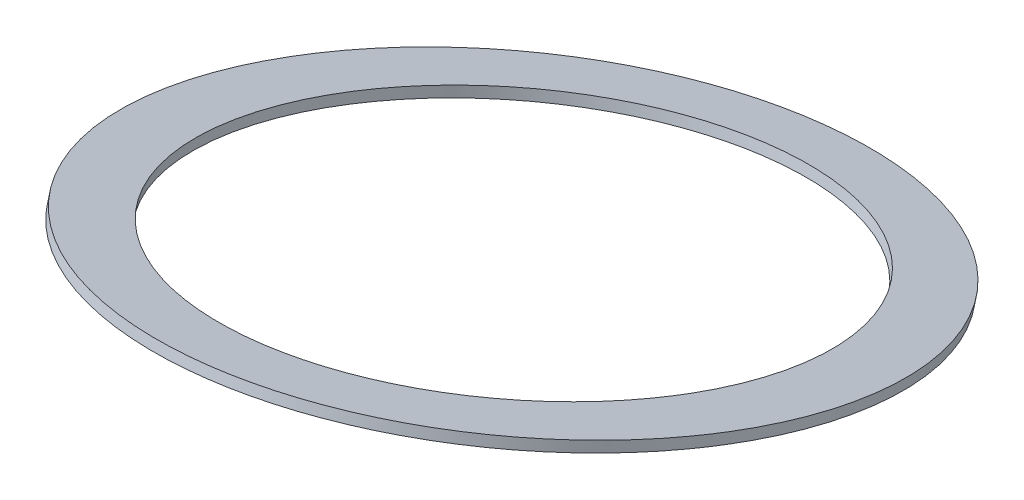
ISO-10303-21;
HEADER;
FILE_DESCRIPTION(('STEP AP214'),'2;1');
FILE_NAME('part.step','',(''),(''),'','','');
FILE_SCHEMA(('AUTOMOTIVE_DESIGN { 1 0 10303 214 1 1 1 1 }'));
ENDSEC;
DATA;
#1=APPLICATION_CONTEXT('core data for automotive mechanical design processes');
#2=APPLICATION_PROTOCOL_DEFINITION('international standard','automotive_design',2000,#1);
#3=PRODUCT_CONTEXT('',#1,'mechanical');
#4=PRODUCT('Part','Part','',(#3));
#5=PRODUCT_RELATED_PRODUCT_CATEGORY('part','',(#4));
#6=PRODUCT_DEFINITION_FORMATION('','',#4);
#7=PRODUCT_DEFINITION_CONTEXT('part definition',#1,'design');
#8=PRODUCT_DEFINITION('design','',#6,#7);
#9=PRODUCT_DEFINITION_SHAPE('','',#8);
#10=(LENGTH_UNIT() NAMED_UNIT(*) SI_UNIT(.MILLI.,.METRE.));
#11=(NAMED_UNIT(*) PLANE_ANGLE_UNIT() SI_UNIT($,.RADIAN.));
#12=(NAMED_UNIT(*) SI_UNIT($,.STERADIAN.) SOLID_ANGLE_UNIT());
#13=UNCERTAINTY_MEASURE_WITH_UNIT(LENGTH_MEASURE(1.E-05),#10,'distance_accuracy_value','');
#14=(GEOMETRIC_REPRESENTATION_CONTEXT(3) GLOBAL_UNCERTAINTY_ASSIGNED_CONTEXT((#13)) GLOBAL_UNIT_ASSIGNED_CONTEXT((#10,
#11,#12)) REPRESENTATION_CONTEXT('',''));
#15=CARTESIAN_POINT('',(0.,0.,0.));
#16=DIRECTION('',(0.,0.,1.));
#17=DIRECTION('',(1.,0.,0.));
#18=AXIS2_PLACEMENT_3D('',#15,#16,#17);
#19=CARTESIAN_POINT('',(-85.1750886992861,247.771421411918,306.996455193439));
#20=DIRECTION('',(-1.42371003184444E-12,0.965925826288984,-0.258819045102834));
#21=DIRECTION('',(0.,0.258819045102834,0.965925826288984));
#22=AXIS2_PLACEMENT_3D('',#19,#20,#21);
#23=PLANE('',#22);
#24=CARTESIAN_POINT('',(306.172324204594,287.085811790094,453.719757550954));
#25=CARTESIAN_POINT('',(304.347898869861,288.956927303349,460.702855713253));
#26=CARTESIAN_POINT('',(300.181465313322,292.645550283985,474.468984086958));
#27=CARTESIAN_POINT('',(292.344724914454,298.027835466678,494.555945849613));
#28=CARTESIAN_POINT('',(282.869375430062,303.247590412852,514.03633651182));
#29=CARTESIAN_POINT('',(271.571170782028,308.316665218783,532.954381234959));
#30=CARTESIAN_POINT('',(258.681952759475,313.06679025664,550.682089218597));
#31=CARTESIAN_POINT('',(246.534327868975,316.756561577623,564.452503256866));
#32=CARTESIAN_POINT('',(235.911531852767,319.529477051817,574.801164691699));
#33=CARTESIAN_POINT('',(227.43267465512,321.521462309189,582.23535488018));
#34=CARTESIAN_POINT('',(218.544747077013,323.390815552696,589.21187616228));
#35=CARTESIAN_POINT('',(206.227945190573,325.696036603486,597.815078246566));
#36=CARTESIAN_POINT('',(193.160898285605,327.72098561537,605.372290841716));
#37=CARTESIAN_POINT('',(179.302732626675,329.439333581655,611.785252757044));
#38=CARTESIAN_POINT('',(164.860262144062,330.941386466919,617.390990440582));
#39=CARTESIAN_POINT('',(146.416027587362,332.328428957376,622.567503487321));
#40=CARTESIAN_POINT('',(127.414909645774,333.06239457043,625.306700446353));
#41=CARTESIAN_POINT('',(111.846517312567,333.236492765333,625.956443755325));
#42=CARTESIAN_POINT('',(96.2125718884808,333.123225988225,625.533726388438));
#43=CARTESIAN_POINT('',(80.9326361163903,332.592123816764,623.551626100627));
#44=CARTESIAN_POINT('',(65.9353039258245,331.661765596812,620.079481954617));
#45=CARTESIAN_POINT('',(54.8124778014216,330.761913390014,616.721187799611));
#46=CARTESIAN_POINT('',(43.9559654122342,329.673499386688,612.659171439596));
#47=CARTESIAN_POINT('',(30.0274839986701,328.002141646771,606.421579436691));
#48=CARTESIAN_POINT('',(13.5123246732928,325.514237086506,597.136593213505));
#49=CARTESIAN_POINT('',(-4.94441674262312,321.919759132723,583.721818863426));
#50=CARTESIAN_POINT('',(-21.4596846960897,317.898170423827,568.713045474796));
#51=CARTESIAN_POINT('',(-33.8343565279769,314.209950617947,554.94842176986));
#52=CARTESIAN_POINT('',(-42.9246444814503,311.071119908982,543.23414608771));
#53=CARTESIAN_POINT('',(-51.3653502480686,307.856486533659,531.236971003364));
#54=CARTESIAN_POINT('',(-60.8017938652706,303.689728104091,515.686416841426));
#55=CARTESIAN_POINT('',(-70.4565188895138,298.471996185195,496.213576219914));
#56=CARTESIAN_POINT('',(-78.512376720301,293.036524897963,475.928121212957));
#57=CARTESIAN_POINT('',(-84.8500700920656,287.528706367179,455.372662617264));
#58=CARTESIAN_POINT('',(-89.5994965951459,281.930690016293,434.480581174212));
#59=CARTESIAN_POINT('',(-92.7963345649909,276.246792883488,413.267988289637));
#60=CARTESIAN_POINT('',(-94.4358148106084,270.477608486196,391.737099000747));
#61=CARTESIAN_POINT('',(-94.5050451682542,264.760975061684,370.40233261225));
#62=CARTESIAN_POINT('',(-93.0473258657436,259.06876945579,349.158732083945));
#63=CARTESIAN_POINT('',(-90.5462152798631,254.348337622781,331.541840649501));
#64=CARTESIAN_POINT('',(-87.7522469480194,250.586979834403,317.504262277834));
#65=CARTESIAN_POINT('',(-85.2411190779154,247.766124344934,306.976686270327));
#66=CARTESIAN_POINT('',(-82.3338089360355,244.977051257366,296.567723801495));
#67=CARTESIAN_POINT('',(-77.9470202599356,241.31934658634,282.916984130138));
#68=CARTESIAN_POINT('',(-71.4944561764333,236.852479607525,266.246409614535));
#69=CARTESIAN_POINT('',(-62.1541687799811,231.666348131173,246.891503450031));
#70=CARTESIAN_POINT('',(-52.9566951313783,227.495100936127,231.324196987157));
#71=CARTESIAN_POINT('',(-44.6764288992194,224.257334131627,219.240686769673));
#72=CARTESIAN_POINT('',(-35.7264851087814,221.085010381284,207.401413355299));
#73=CARTESIAN_POINT('',(-23.5646612231756,217.362393185258,193.508416842553));
#74=CARTESIAN_POINT('',(-9.99852300947815,213.965939923917,180.832680705635));
#75=CARTESIAN_POINT('',(1.75158108457008,211.467006989595,171.506536029981));
#76=CARTESIAN_POINT('',(11.0809948387451,209.701426807969,164.917301087271));
#77=CARTESIAN_POINT('',(20.7639895852223,208.085341519981,158.88598868309));
#78=CARTESIAN_POINT('',(34.1086959229064,206.142304335743,151.63447519045));
#79=CARTESIAN_POINT('',(51.5992269322183,204.116634694154,144.074573168602));
#80=CARTESIAN_POINT('',(74.1564097435158,202.384846270261,137.611450782555));
#81=CARTESIAN_POINT('',(97.0357398750421,201.488230458563,134.265235018302));
#82=CARTESIAN_POINT('',(116.39726679754,201.425518300238,134.03119005707));
#83=CARTESIAN_POINT('',(132.046568714272,201.807641308455,135.457292538383));
#84=CARTESIAN_POINT('',(147.355123707105,202.465442949421,137.912241683682));
#85=CARTESIAN_POINT('',(162.242301577195,203.519836041783,141.847290275434));
#86=CARTESIAN_POINT('',(176.705758397232,204.955554122464,147.205463097793));
#87=CARTESIAN_POINT('',(190.83916606226,206.639631548592,153.490525615893));
#88=CARTESIAN_POINT('',(204.082189267613,208.630469891249,160.920435460259));
#89=CARTESIAN_POINT('',(216.571724679042,210.906684659648,169.41538462478));
#90=CARTESIAN_POINT('',(225.568153233057,212.753105522893,176.306321098506));
#91=CARTESIAN_POINT('',(234.17461363653,214.729098462025,183.680827142682));
#92=CARTESIAN_POINT('',(244.974628850679,217.488419778236,193.978754489114));
#93=CARTESIAN_POINT('',(254.875841470718,220.436701957721,204.981893377932));
#94=CARTESIAN_POINT('',(263.928194447551,223.555144363467,216.620078876587));
#95=CARTESIAN_POINT('',(270.321538809334,225.98442955917,225.686294652975));
#96=CARTESIAN_POINT('',(276.260378064212,228.474746541045,234.980284156237));
#97=CARTESIAN_POINT('',(283.56463050641,231.858331510559,247.607995174132));
#98=CARTESIAN_POINT('',(291.61141022839,236.209135401716,263.845416349631));
#99=CARTESIAN_POINT('',(298.290285089664,240.708345577928,280.636697321122));
#100=CARTESIAN_POINT('',(302.848776874837,244.404082288869,294.429374497708));
#101=CARTESIAN_POINT('',(306.839912787366,248.121566053135,308.303212782217));
#102=CARTESIAN_POINT('',(310.799329030754,252.803038517396,325.774705873029));
#103=CARTESIAN_POINT('',(313.974180659465,258.478359932117,346.955293742007));
#104=CARTESIAN_POINT('',(315.603138506042,264.210349809646,368.347371193374));
#105=CARTESIAN_POINT('',(315.666557308779,270.00857893849,389.986656896115));
#106=CARTESIAN_POINT('',(314.163956535724,275.745007724613,411.395300579909));
#107=CARTESIAN_POINT('',(311.614163444884,280.492715642377,429.113987748491));
#108=CARTESIAN_POINT('',(308.779566484925,284.265736508743,443.195093319782));
#109=CARTESIAN_POINT('',(307.08453687196,286.150254033466,450.228208469804));
#110=CARTESIAN_POINT('',(306.172324204594,287.085811790094,453.719757550954));
#111=B_SPLINE_CURVE_WITH_KNOTS('',3,(#24,#25,#26,#27,#28,#29,#30,#31,#32,#33,#34,#35,#36,#37,
#38,#39,#40,#41,#42,#43,#44,#45,#46,#47,#48,#49,#50,#51,#52,#53,#54,#55,#56,#57,#58,#59,#60,#61,
#62,#63,#64,#65,#66,#67,#68,#69,#70,#71,#72,#73,#74,#75,#76,#77,#78,#79,#80,#81,#82,#83,#84,#85,
#86,#87,#88,#89,#90,#91,#92,#93,#94,#95,#96,#97,#98,#99,#100,#101,#102,#103,#104,#105,#106,#107,
#108,#109,#110),.UNSPECIFIED.,.T.,.F.,(4,1,1,1,1,1,1,1,1,1,1,1,1,1,1,1,1,1,1,1,1,1,1,1,1,1,1,1,
1,1,1,1,1,1,1,1,1,1,1,1,1,1,1,1,1,1,1,1,1,1,1,1,1,1,1,1,1,1,1,1,1,1,1,1,1,1,1,1,1,1,1,1,1,1,1,1,
1,1,1,1,1,1,1,1,4),(0.,0.015625,0.03125,0.046875,0.0625,0.078125,0.09375,0.1015625,0.109375,
0.1171875,0.125,0.140625,0.1484375,0.15625,0.171875,0.1875,0.1953125,0.203125,0.21875,0.2265625,
0.234375,0.2421875,0.25,0.265625,0.28125,0.296875,0.3125,0.3203125,0.328125,0.34375,0.359375,
0.375,0.390625,0.40625,0.421875,0.4375,0.453125,0.46875,0.484375,0.4921875,0.5,0.5078125,
0.515625,0.53125,0.546875,0.5625,0.5703125,0.578125,0.59375,0.609375,0.6171875,0.625,0.6328125,
0.640625,0.65625,0.671875,0.6875,0.703125,0.7109375,0.71875,0.734375,0.7421875,0.75,0.765625,
0.7734375,0.78125,0.7890625,0.796875,0.8125,0.8203125,0.828125,0.8359375,0.84375,0.859375,0.875,
0.8828125,0.890625,0.90625,0.921875,0.9375,0.953125,0.96875,0.984375,0.9921875,1.),.UNSPECIFIED.);
#112=CARTESIAN_POINT('',(306.172324204594,287.085811790094,453.719757550954));
#113=VERTEX_POINT('',#112);
#114=EDGE_CURVE('E10',#113,#113,#111,.T.);
#115=ORIENTED_EDGE('',*,*,#114,.T.);
#116=EDGE_LOOP('',(#115));
#117=FACE_BOUND('',#116,.T.);
#118=CARTESIAN_POINT('',(266.817639882261,283.58054674117,440.637930294618));
#119=CARTESIAN_POINT('',(265.322265847198,285.153344621097,446.507691892541));
#120=CARTESIAN_POINT('',(261.904126751131,288.25041024907,458.066098170516));
#121=CARTESIAN_POINT('',(255.476658523598,292.757728316109,474.887638202592));
#122=CARTESIAN_POINT('',(247.722819432191,297.11350933568,491.143634274298));
#123=CARTESIAN_POINT('',(238.512958949992,301.325136540163,506.861640984001));
#124=CARTESIAN_POINT('',(228.05572208073,305.25308528316,521.520945262431));
#125=CARTESIAN_POINT('',(218.261656909145,308.286455166333,532.841635784622));
#126=CARTESIAN_POINT('',(209.744164153033,310.555909908315,541.311356187216));
#127=CARTESIAN_POINT('',(202.975387930675,312.1801910854,547.373256065902));
#128=CARTESIAN_POINT('',(195.896970610072,313.70225520337,553.053676686578));
#129=CARTESIAN_POINT('',(186.133902048909,315.572098121119,560.032025457837));
#130=CARTESIAN_POINT('',(175.835181831928,317.208035511696,566.137426917521));
#131=CARTESIAN_POINT('',(164.981263272491,318.59266353582,571.304929053191));
#132=CARTESIAN_POINT('',(153.706102688141,319.802910034196,575.821630474869));
#133=CARTESIAN_POINT('',(139.364744505483,320.923026756233,580.001962991997));
#134=CARTESIAN_POINT('',(121.732847794373,321.651086680862,582.719119621764));
#135=CARTESIAN_POINT('',(103.492125815609,321.727454362987,583.004127691613));
#136=CARTESIAN_POINT('',(88.6690658677689,321.238480782929,581.179253447367));
#137=CARTESIAN_POINT('',(76.9902885785219,320.532818455893,578.54568578995));
#138=CARTESIAN_POINT('',(68.2974370083837,319.84209638036,575.967875910204));
#139=CARTESIAN_POINT('',(59.7796304433671,318.999570191684,572.823525367414));
#140=CARTESIAN_POINT('',(48.8012965312066,317.695385213135,567.956240765067));
#141=CARTESIAN_POINT('',(35.6916324508077,315.73552010179,560.641924593633));
#142=CARTESIAN_POINT('',(20.8990690958388,312.869670156692,549.946426991758));
#143=CARTESIAN_POINT('',(7.53778577796836,309.629690880527,537.854659717733));
#144=CARTESIAN_POINT('',(-2.57146504460217,306.627526739899,526.650430612321));
#145=CARTESIAN_POINT('',(-10.0337079103882,304.059262532712,517.065538103894));
#146=CARTESIAN_POINT('',(-16.9879301210659,301.420007590385,507.215704565054));
#147=CARTESIAN_POINT('',(-24.8108032739061,297.980232945157,494.378290822538));
#148=CARTESIAN_POINT('',(-32.872721110139,293.64488337339,478.1985459522));
#149=CARTESIAN_POINT('',(-39.6339418636796,289.111997953412,461.281587260015));
#150=CARTESIAN_POINT('',(-44.986861743239,284.50224742447,444.07776407584));
#151=CARTESIAN_POINT('',(-49.0303392979788,279.800121920594,426.529192791858));
#152=CARTESIAN_POINT('',(-51.3217082275455,275.814453825694,411.654476959618));
#153=CARTESIAN_POINT('',(-52.5084786061881,272.580303144593,399.584462298438));
#154=CARTESIAN_POINT('',(-53.2504740716067,269.355195093457,387.548195191718));
#155=CARTESIAN_POINT('',(-53.3643486621752,265.336656400986,372.550804619258));
#156=CARTESIAN_POINT('',(-52.2193171237224,260.537932012041,354.641721388213));
#157=CARTESIAN_POINT('',(-50.1901685914083,256.558568288067,339.790533788552));
#158=CARTESIAN_POINT('',(-47.9062101712495,253.390495151622,327.967123881249));
#159=CARTESIAN_POINT('',(-45.1612198279835,250.224436329799,316.151231498455));
#160=CARTESIAN_POINT('',(-40.92711391214,246.354849047363,301.709735156077));
#161=CARTESIAN_POINT('',(-34.5800334311619,241.867549651482,284.962905821864));
#162=CARTESIAN_POINT('',(-26.9356057342923,237.538015562865,268.80486463002));
#163=CARTESIAN_POINT('',(-19.4337551994741,234.0699412555,255.861835110485));
#164=CARTESIAN_POINT('',(-12.7025154242321,231.386673770442,245.847744525927));
#165=CARTESIAN_POINT('',(-5.45241919379536,228.766870348767,236.070505050363));
#166=CARTESIAN_POINT('',(4.35293152092321,225.706376118181,224.648585085507));
#167=CARTESIAN_POINT('',(15.2186464205768,222.929687982812,214.285843887488));
#168=CARTESIAN_POINT('',(24.5759463224158,220.895597327894,206.694514216087));
#169=CARTESIAN_POINT('',(34.4432242750308,218.984893179505,199.563669256021));
#170=CARTESIAN_POINT('',(47.3815606423098,216.912784532585,191.83045450685));
#171=CARTESIAN_POINT('',(63.8050117973126,214.95511937935,184.524348690687));
#172=CARTESIAN_POINT('',(81.339695892977,213.557254263189,179.307445054951));
#173=CARTESIAN_POINT('',(99.0427940258649,212.818322105869,176.549712700391));
#174=CARTESIAN_POINT('',(114.025775767205,212.736973000022,176.246113704135));
#175=CARTESIAN_POINT('',(126.154437265263,213.01000289796,177.265075155152));
#176=CARTESIAN_POINT('',(138.03668165161,213.5002880002,179.094844066834));
#177=CARTESIAN_POINT('',(152.538183966717,214.503002346179,182.837024951419));
#178=CARTESIAN_POINT('',(169.496979621341,216.335960670869,189.677718547212));
#179=CARTESIAN_POINT('',(182.642271213442,218.297859709068,196.999625437009));
#180=CARTESIAN_POINT('',(192.627314082613,220.108020273276,203.755236632424));
#181=CARTESIAN_POINT('',(199.863805816248,221.586918199425,209.27455883197));
#182=CARTESIAN_POINT('',(206.800520024024,223.173626846936,215.196236121243));
#183=CARTESIAN_POINT('',(215.551088339599,225.401525711,223.510867875992));
#184=CARTESIAN_POINT('',(223.6343817789,227.799876709772,232.461635657737));
#185=CARTESIAN_POINT('',(231.073576962612,230.354433886075,241.995372830481));
#186=CARTESIAN_POINT('',(238.105566233107,233.018095105422,251.936291835184));
#187=CARTESIAN_POINT('',(245.970768483759,236.476184038,264.842055428592));
#188=CARTESIAN_POINT('',(254.026984850007,240.810554751146,281.018147148824));
#189=CARTESIAN_POINT('',(259.64094689957,244.568870860865,295.044373821148));
#190=CARTESIAN_POINT('',(263.484485833846,247.661537200707,306.586361732258));
#191=CARTESIAN_POINT('',(266.855126474046,250.772037243333,318.19490592825));
#192=CARTESIAN_POINT('',(270.223628813987,254.702481903168,332.863525095052));
#193=CARTESIAN_POINT('',(272.955058122431,259.478711613904,350.688657044099));
#194=CARTESIAN_POINT('',(274.395170038203,264.31594342587,368.741451934311));
#195=CARTESIAN_POINT('',(274.521399961762,269.202593866538,386.978679657688));
#196=CARTESIAN_POINT('',(273.33903546527,274.034695683116,405.012329144485));
#197=CARTESIAN_POINT('',(271.269987419745,278.033816536855,419.937251356239));
#198=CARTESIAN_POINT('',(268.95385317837,281.20921738831,431.788008668265));
#199=CARTESIAN_POINT('',(267.565326899792,282.794147801207,437.703049495656));
#200=CARTESIAN_POINT('',(266.817639882261,283.58054674117,440.637930294618));
#201=B_SPLINE_CURVE_WITH_KNOTS('',3,(#118,#119,#120,#121,#122,#123,#124,#125,#126,#127,#128,
#129,#130,#131,#132,#133,#134,#135,#136,#137,#138,#139,#140,#141,#142,#143,#144,#145,#146,#147,
#148,#149,#150,#151,#152,#153,#154,#155,#156,#157,#158,#159,#160,#161,#162,#163,#164,#165,#166,
#167,#168,#169,#170,#171,#172,#173,#174,#175,#176,#177,#178,#179,#180,#181,#182,#183,#184,#185,
#186,#187,#188,#189,#190,#191,#192,#193,#194,#195,#196,#197,#198,#199,#200),.UNSPECIFIED.,.T.,
.F.,(4,1,1,1,1,1,1,1,1,1,1,1,1,1,1,1,1,1,1,1,1,1,1,1,1,1,1,1,1,1,1,1,1,1,1,1,1,1,1,1,1,1,1,1,1,
1,1,1,1,1,1,1,1,1,1,1,1,1,1,1,1,1,1,1,1,1,1,1,1,1,1,1,1,1,1,1,1,1,1,1,4),(0.,0.015625,0.03125,
0.046875,0.0625,0.078125,0.09375,0.1015625,0.109375,0.1171875,0.125,0.140625,0.1484375,0.15625,
0.171875,0.1875,0.203125,0.21875,0.2265625,0.234375,0.2421875,0.25,0.265625,0.28125,0.296875,
0.3125,0.3203125,0.328125,0.34375,0.359375,0.375,0.390625,0.40625,0.421875,0.4296875,0.4375,
0.453125,0.46875,0.484375,0.4921875,0.5,0.515625,0.53125,0.546875,0.5625,0.5703125,0.578125,
0.59375,0.609375,0.6171875,0.625,0.640625,0.65625,0.671875,0.6875,0.703125,0.7109375,0.71875,
0.734375,0.75,0.765625,0.7734375,0.78125,0.7890625,0.796875,0.8125,0.8203125,0.828125,0.84375,
0.859375,0.875,0.8828125,0.890625,0.90625,0.921875,0.9375,0.953125,0.96875,0.984375,0.9921875,
1.),.UNSPECIFIED.);
#202=CARTESIAN_POINT('',(266.817639882261,283.58054674117,440.637930294618));
#203=VERTEX_POINT('',#202);
#204=EDGE_CURVE('E51',#203,#203,#201,.T.);
#205=ORIENTED_EDGE('',*,*,#204,.F.);
#206=EDGE_LOOP('',(#205));
#207=FACE_BOUND('',#206,.T.);
#208=ADVANCED_FACE('F35',(#117,#207),#23,.F.);
#209=CARTESIAN_POINT('',(-85.1750886992965,254.532902195941,305.184721877719));
#210=DIRECTION('',(-1.42371003184444E-12,0.965925826288984,-0.258819045102834));
#211=DIRECTION('',(0.,0.258819045102834,0.965925826288984));
#212=AXIS2_PLACEMENT_3D('',#209,#210,#211);
#213=PLANE('',#212);
#214=CARTESIAN_POINT('',(306.172324204584,293.847292574117,451.908024235234));
#215=CARTESIAN_POINT('',(304.347898869851,295.718408087372,458.891122397533));
#216=CARTESIAN_POINT('',(300.181465313312,299.407031068008,472.657250771238));
#217=CARTESIAN_POINT('',(292.344724914443,304.789316250701,492.744212533893));
#218=CARTESIAN_POINT('',(282.869375430052,310.009071196875,512.2246031961));
#219=CARTESIAN_POINT('',(271.571170782018,315.078146002806,531.142647919239));
#220=CARTESIAN_POINT('',(258.681952759464,319.828271040663,548.870355902877));
#221=CARTESIAN_POINT('',(246.534327868965,323.518042361646,562.640769941146));
#222=CARTESIAN_POINT('',(235.911531852756,326.29095783584,572.989431375979));
#223=CARTESIAN_POINT('',(227.43267465511,328.282943093212,580.42362156446));
#224=CARTESIAN_POINT('',(218.544747077003,330.152296336719,587.40014284656));
#225=CARTESIAN_POINT('',(206.227945190563,332.457517387509,596.003344930846));
#226=CARTESIAN_POINT('',(193.160898285595,334.482466399393,603.560557525996));
#227=CARTESIAN_POINT('',(179.302732626665,336.200814365677,609.973519441324));
#228=CARTESIAN_POINT('',(164.860262144052,337.702867250942,615.579257124862));
#229=CARTESIAN_POINT('',(146.416027587351,339.089909741399,620.755770171601));
#230=CARTESIAN_POINT('',(127.414909645764,339.823875354453,623.494967130634));
#231=CARTESIAN_POINT('',(111.846517312557,339.997973549356,624.144710439606));
#232=CARTESIAN_POINT('',(96.2125718884705,339.884706772248,623.721993072718));
#233=CARTESIAN_POINT('',(80.9326361163799,339.353604600787,621.739892784907));
#234=CARTESIAN_POINT('',(65.9353039258142,338.423246380835,618.267748638897));
#235=CARTESIAN_POINT('',(54.8124778014113,337.523394174037,614.909454483891));
#236=CARTESIAN_POINT('',(43.9559654122238,336.434980170711,610.847438123876));
#237=CARTESIAN_POINT('',(30.0274839986598,334.763622430794,604.609846120971));
#238=CARTESIAN_POINT('',(13.5123246732825,332.275717870529,595.324859897785));
#239=CARTESIAN_POINT('',(-4.94441674263347,328.681239916746,581.910085547706));
#240=CARTESIAN_POINT('',(-21.4596846961001,324.65965120785,566.901312159076));
#241=CARTESIAN_POINT('',(-33.8343565279872,320.97143140197,553.13668845414));
#242=CARTESIAN_POINT('',(-42.9246444814607,317.832600693004,541.42241277199));
#243=CARTESIAN_POINT('',(-51.3653502480789,314.617967317682,529.425237687645));
#244=CARTESIAN_POINT('',(-60.801793865281,310.451208888114,513.874683525706));
#245=CARTESIAN_POINT('',(-70.4565188895241,305.233476969218,494.401842904194));
#246=CARTESIAN_POINT('',(-78.5123767203114,299.798005681986,474.116387897237));
#247=CARTESIAN_POINT('',(-84.850070092076,294.290187151202,453.560929301544));
#248=CARTESIAN_POINT('',(-89.5994965951562,288.692170800316,432.668847858492));
#249=CARTESIAN_POINT('',(-92.7963345650013,283.008273667511,411.456254973917));
#250=CARTESIAN_POINT('',(-94.4358148106187,277.239089270219,389.925365685027));
#251=CARTESIAN_POINT('',(-94.5050451682646,271.522455845707,368.59059929653));
#252=CARTESIAN_POINT('',(-93.047325865754,265.830250239813,347.346998768226));
#253=CARTESIAN_POINT('',(-90.5462152798734,261.109818406804,329.730107333781));
#254=CARTESIAN_POINT('',(-87.7522469480298,257.348460618426,315.692528962114));
#255=CARTESIAN_POINT('',(-85.2411190779258,254.527605128957,305.164952954607));
#256=CARTESIAN_POINT('',(-82.3338089360459,251.738532041389,294.755990485775));
#257=CARTESIAN_POINT('',(-77.9470202599459,248.080827370363,281.105250814418));
#258=CARTESIAN_POINT('',(-71.4944561764436,243.613960391548,264.434676298816));
#259=CARTESIAN_POINT('',(-62.1541687799915,238.427828915196,245.079770134311));
#260=CARTESIAN_POINT('',(-52.9566951313886,234.25658172015,229.512463671438));
#261=CARTESIAN_POINT('',(-44.6764288992298,231.01881491565,217.428953453953));
#262=CARTESIAN_POINT('',(-35.7264851087917,227.846491165307,205.589680039579));
#263=CARTESIAN_POINT('',(-23.5646612231859,224.123873969281,191.696683526833));
#264=CARTESIAN_POINT('',(-9.99852300948849,220.72742070794,179.020947389915));
#265=CARTESIAN_POINT('',(1.75158108455973,218.228487773618,169.694802714261));
#266=CARTESIAN_POINT('',(11.0809948387348,216.462907591991,163.105567771551));
#267=CARTESIAN_POINT('',(20.7639895852119,214.846822304004,157.07425536737));
#268=CARTESIAN_POINT('',(34.108695922896,212.903785119766,149.822741874731));
#269=CARTESIAN_POINT('',(51.599226932208,210.878115478177,142.262839852882));
#270=CARTESIAN_POINT('',(74.1564097435055,209.146327054284,135.799717466835));
#271=CARTESIAN_POINT('',(97.0357398750318,208.249711242586,132.453501702582));
#272=CARTESIAN_POINT('',(116.39726679753,208.186999084261,132.21945674135));
#273=CARTESIAN_POINT('',(132.046568714262,208.569122092477,133.645559222663));
#274=CARTESIAN_POINT('',(147.355123707095,209.226923733444,136.100508367962));
#275=CARTESIAN_POINT('',(162.242301577184,210.281316825805,140.035556959714));
#276=CARTESIAN_POINT('',(176.705758397221,211.717034906487,145.393729782073));
#277=CARTESIAN_POINT('',(190.83916606225,213.401112332615,151.678792300173));
#278=CARTESIAN_POINT('',(204.082189267603,215.391950675272,159.108702144539));
#279=CARTESIAN_POINT('',(216.571724679031,217.668165443671,167.60365130906));
#280=CARTESIAN_POINT('',(225.568153233046,219.514586306916,174.494587782786));
#281=CARTESIAN_POINT('',(234.17461363652,221.490579246047,181.869093826962));
#282=CARTESIAN_POINT('',(244.974628850669,224.249900562259,192.167021173394));
#283=CARTESIAN_POINT('',(254.875841470707,227.198182741744,203.170160062212));
#284=CARTESIAN_POINT('',(263.928194447541,230.31662514749,214.808345560867));
#285=CARTESIAN_POINT('',(270.321538809324,232.745910343193,223.874561337255));
#286=CARTESIAN_POINT('',(276.260378064202,235.236227325068,233.168550840517));
#287=CARTESIAN_POINT('',(283.564630506399,238.619812294582,245.796261858412));
#288=CARTESIAN_POINT('',(291.61141022838,242.970616185739,262.033683033911));
#289=CARTESIAN_POINT('',(298.290285089653,247.469826361951,278.824964005402));
#290=CARTESIAN_POINT('',(302.848776874827,251.165563072892,292.617641181988));
#291=CARTESIAN_POINT('',(306.839912787356,254.883046837157,306.491479466497));
#292=CARTESIAN_POINT('',(310.799329030744,259.564519301419,323.962972557309));
#293=CARTESIAN_POINT('',(313.974180659455,265.23984071614,345.143560426287));
#294=CARTESIAN_POINT('',(315.603138506031,270.971830593669,366.535637877654));
#295=CARTESIAN_POINT('',(315.666557308768,276.770059722512,388.174923580395));
#296=CARTESIAN_POINT('',(314.163956535713,282.506488508636,409.58356726419));
#297=CARTESIAN_POINT('',(311.614163444874,287.2541964264,427.302254432771));
#298=CARTESIAN_POINT('',(308.779566484914,291.027217292765,441.383360004062));
#299=CARTESIAN_POINT('',(307.08453687195,292.911734817489,448.416475154084));
#300=CARTESIAN_POINT('',(306.172324204584,293.847292574117,451.908024235234));
#301=B_SPLINE_CURVE_WITH_KNOTS('',3,(#214,#215,#216,#217,#218,#219,#220,#221,#222,#223,#224,
#225,#226,#227,#228,#229,#230,#231,#232,#233,#234,#235,#236,#237,#238,#239,#240,#241,#242,#243,
#244,#245,#246,#247,#248,#249,#250,#251,#252,#253,#254,#255,#256,#257,#258,#259,#260,#261,#262,
#263,#264,#265,#266,#267,#268,#269,#270,#271,#272,#273,#274,#275,#276,#277,#278,#279,#280,#281,
#282,#283,#284,#285,#286,#287,#288,#289,#290,#291,#292,#293,#294,#295,#296,#297,#298,#299,#300),
.UNSPECIFIED.,.T.,.F.,(4,1,1,1,1,1,1,1,1,1,1,1,1,1,1,1,1,1,1,1,1,1,1,1,1,1,1,1,1,1,1,1,1,1,1,1,
1,1,1,1,1,1,1,1,1,1,1,1,1,1,1,1,1,1,1,1,1,1,1,1,1,1,1,1,1,1,1,1,1,1,1,1,1,1,1,1,1,1,1,1,1,1,1,1,
4),(0.,0.015625,0.03125,0.046875,0.0625,0.078125,0.09375,0.1015625,0.109375,0.1171875,0.125,
0.140625,0.1484375,0.15625,0.171875,0.1875,0.1953125,0.203125,0.21875,0.2265625,0.234375,
0.2421875,0.25,0.265625,0.28125,0.296875,0.3125,0.3203125,0.328125,0.34375,0.359375,0.375,
0.390625,0.40625,0.421875,0.4375,0.453125,0.46875,0.484375,0.4921875,0.5,0.5078125,0.515625,
0.53125,0.546875,0.5625,0.5703125,0.578125,0.59375,0.609375,0.6171875,0.625,0.6328125,0.640625,
0.65625,0.671875,0.6875,0.703125,0.7109375,0.71875,0.734375,0.7421875,0.75,0.765625,0.7734375,
0.78125,0.7890625,0.796875,0.8125,0.8203125,0.828125,0.8359375,0.84375,0.859375,0.875,0.8828125,
0.890625,0.90625,0.921875,0.9375,0.953125,0.96875,0.984375,0.9921875,1.),.UNSPECIFIED.);
#302=CARTESIAN_POINT('',(306.172324204584,293.847292574117,451.908024235234));
#303=VERTEX_POINT('',#302);
#304=EDGE_CURVE('E40',#303,#303,#301,.T.);
#305=ORIENTED_EDGE('',*,*,#304,.F.);
#306=EDGE_LOOP('',(#305));
#307=FACE_BOUND('',#306,.T.);
#308=CARTESIAN_POINT('',(266.81763988225,290.342027525193,438.826196978898));
#309=CARTESIAN_POINT('',(265.322265847188,291.91482540512,444.695958576821));
#310=CARTESIAN_POINT('',(261.904126751121,295.011891033093,456.254364854797));
#311=CARTESIAN_POINT('',(255.476658523587,299.519209100132,473.075904886872));
#312=CARTESIAN_POINT('',(247.72281943218,303.874990119703,489.331900958578));
#313=CARTESIAN_POINT('',(238.512958949981,308.086617324186,505.049907668281));
#314=CARTESIAN_POINT('',(228.055722080719,312.014566067183,519.709211946711));
#315=CARTESIAN_POINT('',(218.261656909134,315.047935950356,531.029902468902));
#316=CARTESIAN_POINT('',(209.744164153023,317.317390692338,539.499622871496));
#317=CARTESIAN_POINT('',(202.975387930664,318.941671869422,545.561522750182));
#318=CARTESIAN_POINT('',(195.896970610061,320.463735987393,551.241943370858));
#319=CARTESIAN_POINT('',(186.133902048899,322.333578905142,558.220292142117));
#320=CARTESIAN_POINT('',(175.835181831918,323.969516295719,564.325693601801));
#321=CARTESIAN_POINT('',(164.981263272481,325.354144319843,569.493195737472));
#322=CARTESIAN_POINT('',(153.706102688131,326.564390818218,574.00989715915));
#323=CARTESIAN_POINT('',(139.364744505472,327.684507540256,578.190229676277));
#324=CARTESIAN_POINT('',(121.732847794363,328.412567464885,580.907386306044));
#325=CARTESIAN_POINT('',(103.492125815598,328.488935147009,581.192394375893));
#326=CARTESIAN_POINT('',(88.6690658677585,327.999961566952,579.367520131647));
#327=CARTESIAN_POINT('',(76.9902885785116,327.294299239916,576.73395247423));
#328=CARTESIAN_POINT('',(68.2974370083733,326.603577164383,574.156142594485));
#329=CARTESIAN_POINT('',(59.7796304433568,325.761050975707,571.011792051694));
#330=CARTESIAN_POINT('',(48.8012965311963,324.456865997157,566.144507449347));
#331=CARTESIAN_POINT('',(35.6916324507973,322.497000885813,558.830191277913));
#332=CARTESIAN_POINT('',(20.8990690958284,319.631150940715,548.134693676038));
#333=CARTESIAN_POINT('',(7.53778577795801,316.39117166455,536.042926402013));
#334=CARTESIAN_POINT('',(-2.57146504461252,313.389007523922,524.838697296601));
#335=CARTESIAN_POINT('',(-10.0337079103986,310.820743316735,515.253804788174));
#336=CARTESIAN_POINT('',(-16.9879301210762,308.181488374408,505.403971249334));
#337=CARTESIAN_POINT('',(-24.8108032739165,304.74171372918,492.566557506818));
#338=CARTESIAN_POINT('',(-32.8727211101493,300.406364157413,476.38681263648));
#339=CARTESIAN_POINT('',(-39.63394186369,295.873478737435,459.469853944295));
#340=CARTESIAN_POINT('',(-44.9868617432494,291.263728208493,442.26603076012));
#341=CARTESIAN_POINT('',(-49.0303392979892,286.561602704617,424.717459476138));
#342=CARTESIAN_POINT('',(-51.3217082275558,282.575934609717,409.842743643898));
#343=CARTESIAN_POINT('',(-52.5084786061985,279.341783928616,397.772728982718));
#344=CARTESIAN_POINT('',(-53.2504740716171,276.11667587748,385.736461875998));
#345=CARTESIAN_POINT('',(-53.3643486621855,272.098137185009,370.739071303538));
#346=CARTESIAN_POINT('',(-52.2193171237327,267.299412796064,352.829988072493));
#347=CARTESIAN_POINT('',(-50.1901685914187,263.320049072089,337.978800472832));
#348=CARTESIAN_POINT('',(-47.9062101712598,260.151975935645,326.155390565529));
#349=CARTESIAN_POINT('',(-45.1612198279938,256.985917113822,314.339498182735));
#350=CARTESIAN_POINT('',(-40.9271139121503,253.116329831386,299.898001840357));
#351=CARTESIAN_POINT('',(-34.5800334311722,248.629030435505,283.151172506144));
#352=CARTESIAN_POINT('',(-26.9356057343027,244.299496346888,266.993131314301));
#353=CARTESIAN_POINT('',(-19.4337551994845,240.831422039523,254.050101794765));
#354=CARTESIAN_POINT('',(-12.7025154242424,238.148154554465,244.036011210207));
#355=CARTESIAN_POINT('',(-5.45241919380571,235.52835113279,234.258771734644));
#356=CARTESIAN_POINT('',(4.35293152091286,232.467856902204,222.836851769787));
#357=CARTESIAN_POINT('',(15.2186464205664,229.691168766835,212.474110571768));
#358=CARTESIAN_POINT('',(24.5759463224054,227.657078111916,204.882780900367));
#359=CARTESIAN_POINT('',(34.4432242750204,225.746373963528,197.751935940301));
#360=CARTESIAN_POINT('',(47.3815606422995,223.674265316608,190.01872119113));
#361=CARTESIAN_POINT('',(63.8050117973023,221.716600163373,182.712615374967));
#362=CARTESIAN_POINT('',(81.3396958929667,220.318735047212,177.495711739231));
#363=CARTESIAN_POINT('',(99.0427940258545,219.579802889892,174.737979384671));
#364=CARTESIAN_POINT('',(114.025775767194,219.498453784045,174.434380388415));
#365=CARTESIAN_POINT('',(126.154437265253,219.771483681983,175.453341839432));
#366=CARTESIAN_POINT('',(138.0366816516,220.261768784222,177.283110751114));
#367=CARTESIAN_POINT('',(152.538183966706,221.264483130202,181.025291635699));
#368=CARTESIAN_POINT('',(169.49697962133,223.097441454891,187.865985231492));
#369=CARTESIAN_POINT('',(182.642271213431,225.059340493091,195.187892121289));
#370=CARTESIAN_POINT('',(192.627314082603,226.869501057299,201.943503316704));
#371=CARTESIAN_POINT('',(199.863805816238,228.348398983448,207.46282551625));
#372=CARTESIAN_POINT('',(206.800520024013,229.935107630959,213.384502805523));
#373=CARTESIAN_POINT('',(215.551088339588,232.163006495022,221.699134560272));
#374=CARTESIAN_POINT('',(223.63438177889,234.561357493795,230.649902342017));
#375=CARTESIAN_POINT('',(231.073576962602,237.115914670098,240.183639514762));
#376=CARTESIAN_POINT('',(238.105566233097,239.779575889445,250.124558519464));
#377=CARTESIAN_POINT('',(245.970768483749,243.237664822023,263.030322112872));
#378=CARTESIAN_POINT('',(254.026984849997,247.572035535169,279.206413833104));
#379=CARTESIAN_POINT('',(259.64094689956,251.330351644887,293.232640505428));
#380=CARTESIAN_POINT('',(263.484485833835,254.423017984729,304.774628416538));
#381=CARTESIAN_POINT('',(266.855126474036,257.533518027356,316.38317261253));
#382=CARTESIAN_POINT('',(270.223628813977,261.463962687191,331.051791779332));
#383=CARTESIAN_POINT('',(272.955058122421,266.240192397927,348.876923728379));
#384=CARTESIAN_POINT('',(274.395170038193,271.077424209892,366.929718618591));
#385=CARTESIAN_POINT('',(274.521399961752,275.964074650561,385.166946341969));
#386=CARTESIAN_POINT('',(273.339035465259,280.796176467139,403.200595828765));
#387=CARTESIAN_POINT('',(271.269987419735,284.795297320878,418.125518040519));
#388=CARTESIAN_POINT('',(268.95385317836,287.970698172333,429.976275352545));
#389=CARTESIAN_POINT('',(267.565326899782,289.55562858523,435.891316179936));
#390=CARTESIAN_POINT('',(266.81763988225,290.342027525193,438.826196978898));
#391=B_SPLINE_CURVE_WITH_KNOTS('',3,(#308,#309,#310,#311,#312,#313,#314,#315,#316,#317,#318,
#319,#320,#321,#322,#323,#324,#325,#326,#327,#328,#329,#330,#331,#332,#333,#334,#335,#336,#337,
#338,#339,#340,#341,#342,#343,#344,#345,#346,#347,#348,#349,#350,#351,#352,#353,#354,#355,#356,
#357,#358,#359,#360,#361,#362,#363,#364,#365,#366,#367,#368,#369,#370,#371,#372,#373,#374,#375,
#376,#377,#378,#379,#380,#381,#382,#383,#384,#385,#386,#387,#388,#389,#390),.UNSPECIFIED.,.T.,
.F.,(4,1,1,1,1,1,1,1,1,1,1,1,1,1,1,1,1,1,1,1,1,1,1,1,1,1,1,1,1,1,1,1,1,1,1,1,1,1,1,1,1,1,1,1,1,
1,1,1,1,1,1,1,1,1,1,1,1,1,1,1,1,1,1,1,1,1,1,1,1,1,1,1,1,1,1,1,1,1,1,1,4),(0.,0.015625,0.03125,
0.046875,0.0625,0.078125,0.09375,0.1015625,0.109375,0.1171875,0.125,0.140625,0.1484375,0.15625,
0.171875,0.1875,0.203125,0.21875,0.2265625,0.234375,0.2421875,0.25,0.265625,0.28125,0.296875,
0.3125,0.3203125,0.328125,0.34375,0.359375,0.375,0.390625,0.40625,0.421875,0.4296875,0.4375,
0.453125,0.46875,0.484375,0.4921875,0.5,0.515625,0.53125,0.546875,0.5625,0.5703125,0.578125,
0.59375,0.609375,0.6171875,0.625,0.640625,0.65625,0.671875,0.6875,0.703125,0.7109375,0.71875,
0.734375,0.75,0.765625,0.7734375,0.78125,0.7890625,0.796875,0.8125,0.8203125,0.828125,0.84375,
0.859375,0.875,0.8828125,0.890625,0.90625,0.921875,0.9375,0.953125,0.96875,0.984375,0.9921875,
1.),.UNSPECIFIED.);
#392=CARTESIAN_POINT('',(266.81763988225,290.342027525193,438.826196978898));
#393=VERTEX_POINT('',#392);
#394=EDGE_CURVE('E56',#393,#393,#391,.T.);
#395=ORIENTED_EDGE('',*,*,#394,.T.);
#396=EDGE_LOOP('',(#395));
#397=FACE_BOUND('',#396,.T.);
#398=ADVANCED_FACE('F81',(#307,#397),#213,.T.);
#399=DIRECTION('',(-1.47826639905522E-12,0.96592582628898,-0.258819045102849));
#400=VECTOR('',#399,1.);
#401=SURFACE_OF_LINEAR_EXTRUSION('',#111,#400);
#402=ORIENTED_EDGE('',*,*,#114,.F.);
#403=EDGE_LOOP('',(#402));
#404=FACE_BOUND('',#403,.T.);
#405=ORIENTED_EDGE('',*,*,#304,.T.);
#406=EDGE_LOOP('',(#405));
#407=FACE_BOUND('',#406,.T.);
#408=ADVANCED_FACE('F37',(#404,#407),#401,.F.);
#409=DIRECTION('',(-1.47826639905522E-12,0.96592582628898,-0.258819045102849));
#410=VECTOR('',#409,1.);
#411=SURFACE_OF_LINEAR_EXTRUSION('',#201,#410);
#412=ORIENTED_EDGE('',*,*,#204,.T.);
#413=EDGE_LOOP('',(#412));
#414=FACE_BOUND('',#413,.T.);
#415=ORIENTED_EDGE('',*,*,#394,.F.);
#416=EDGE_LOOP('',(#415));
#417=FACE_BOUND('',#416,.T.);
#418=ADVANCED_FACE('F76',(#414,#417),#411,.T.);
#419=CLOSED_SHELL('',(#208,#398,#408,#418));
#420=MANIFOLD_SOLID_BREP('B2',#419);
#421=ADVANCED_BREP_SHAPE_REPRESENTATION('',(#18,#420),#14);
#422=SHAPE_DEFINITION_REPRESENTATION(#9,#421);
ENDSEC;
END-ISO-10303-21;
